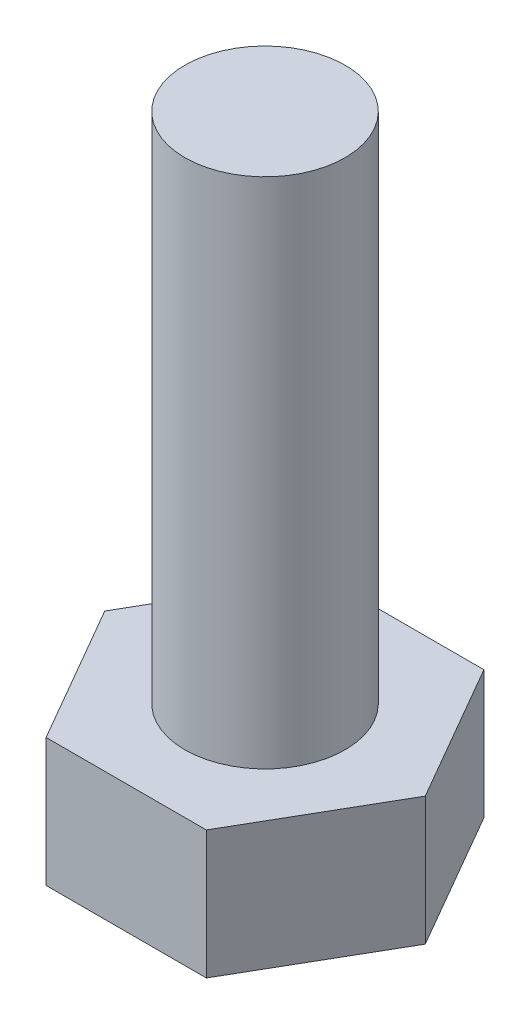
ISO-10303-21;
HEADER;
FILE_DESCRIPTION(('STEP AP214'),'2;1');
FILE_NAME('part.step','',(''),(''),'','','');
FILE_SCHEMA(('AUTOMOTIVE_DESIGN { 1 0 10303 214 1 1 1 1 }'));
ENDSEC;
DATA;
#1=APPLICATION_CONTEXT('core data for automotive mechanical design processes');
#2=APPLICATION_PROTOCOL_DEFINITION('international standard','automotive_design',2000,#1);
#3=PRODUCT_CONTEXT('',#1,'mechanical');
#4=PRODUCT('Part','Part','',(#3));
#5=PRODUCT_RELATED_PRODUCT_CATEGORY('part','',(#4));
#6=PRODUCT_DEFINITION_FORMATION('','',#4);
#7=PRODUCT_DEFINITION_CONTEXT('part definition',#1,'design');
#8=PRODUCT_DEFINITION('design','',#6,#7);
#9=PRODUCT_DEFINITION_SHAPE('','',#8);
#10=(LENGTH_UNIT() NAMED_UNIT(*) SI_UNIT(.MILLI.,.METRE.));
#11=(NAMED_UNIT(*) PLANE_ANGLE_UNIT() SI_UNIT($,.RADIAN.));
#12=(NAMED_UNIT(*) SI_UNIT($,.STERADIAN.) SOLID_ANGLE_UNIT());
#13=UNCERTAINTY_MEASURE_WITH_UNIT(LENGTH_MEASURE(1.E-05),#10,'distance_accuracy_value','');
#14=(GEOMETRIC_REPRESENTATION_CONTEXT(3) GLOBAL_UNCERTAINTY_ASSIGNED_CONTEXT((#13)) GLOBAL_UNIT_ASSIGNED_CONTEXT((#10,
#11,#12)) REPRESENTATION_CONTEXT('',''));
#15=CARTESIAN_POINT('',(0.,0.,0.));
#16=DIRECTION('',(0.,0.,1.));
#17=DIRECTION('',(1.,0.,0.));
#18=AXIS2_PLACEMENT_3D('',#15,#16,#17);
#19=CARTESIAN_POINT('',(2.5,2.,0.));
#20=DIRECTION('',(-0.866025403784439,0.,0.5));
#21=DIRECTION('',(0.5,0.,0.866025403784439));
#22=AXIS2_PLACEMENT_3D('',#19,#20,#21);
#23=PLANE('',#22);
#24=DIRECTION('',(-0.5,0.,-0.866025403784439));
#25=VECTOR('',#24,1.);
#26=CARTESIAN_POINT('',(2.5,0.,0.));
#27=LINE('',#26,#25);
#28=CARTESIAN_POINT('',(2.5,0.,0.));
#29=VERTEX_POINT('',#28);
#30=CARTESIAN_POINT('',(1.25,0.,-2.1650635094611));
#31=VERTEX_POINT('',#30);
#32=EDGE_CURVE('E134',#29,#31,#27,.T.);
#33=ORIENTED_EDGE('',*,*,#32,.T.);
#34=DIRECTION('',(0.,-1.,0.));
#35=VECTOR('',#34,1.);
#36=CARTESIAN_POINT('',(1.25,2.,-2.1650635094611));
#37=LINE('',#36,#35);
#38=CARTESIAN_POINT('',(1.25,2.,-2.1650635094611));
#39=VERTEX_POINT('',#38);
#40=EDGE_CURVE('E46',#39,#31,#37,.T.);
#41=ORIENTED_EDGE('',*,*,#40,.F.);
#42=DIRECTION('',(-0.5,0.,-0.866025403784439));
#43=VECTOR('',#42,1.);
#44=CARTESIAN_POINT('',(2.5,2.,0.));
#45=LINE('',#44,#43);
#46=CARTESIAN_POINT('',(2.5,2.,0.));
#47=VERTEX_POINT('',#46);
#48=EDGE_CURVE('E151',#47,#39,#45,.T.);
#49=ORIENTED_EDGE('',*,*,#48,.F.);
#50=DIRECTION('',(0.,-1.,0.));
#51=VECTOR('',#50,1.);
#52=CARTESIAN_POINT('',(2.5,2.,0.));
#53=LINE('',#52,#51);
#54=EDGE_CURVE('E130',#47,#29,#53,.T.);
#55=ORIENTED_EDGE('',*,*,#54,.T.);
#56=EDGE_LOOP('',(#33,#41,#49,#55));
#57=FACE_BOUND('',#56,.T.);
#58=ADVANCED_FACE('F43',(#57),#23,.F.);
#59=CARTESIAN_POINT('',(1.25,2.,-2.1650635094611));
#60=DIRECTION('',(0.,0.,1.));
#61=DIRECTION('',(1.,0.,0.));
#62=AXIS2_PLACEMENT_3D('',#59,#60,#61);
#63=PLANE('',#62);
#64=DIRECTION('',(-1.,0.,0.));
#65=VECTOR('',#64,1.);
#66=CARTESIAN_POINT('',(1.25,0.,-2.1650635094611));
#67=LINE('',#66,#65);
#68=CARTESIAN_POINT('',(-1.25,0.,-2.1650635094611));
#69=VERTEX_POINT('',#68);
#70=EDGE_CURVE('E138',#31,#69,#67,.T.);
#71=ORIENTED_EDGE('',*,*,#70,.T.);
#72=DIRECTION('',(0.,-1.,0.));
#73=VECTOR('',#72,1.);
#74=CARTESIAN_POINT('',(-1.25,2.,-2.1650635094611));
#75=LINE('',#74,#73);
#76=CARTESIAN_POINT('',(-1.25,2.,-2.1650635094611));
#77=VERTEX_POINT('',#76);
#78=EDGE_CURVE('E157',#77,#69,#75,.T.);
#79=ORIENTED_EDGE('',*,*,#78,.F.);
#80=DIRECTION('',(-1.,0.,0.));
#81=VECTOR('',#80,1.);
#82=CARTESIAN_POINT('',(1.25,2.,-2.1650635094611));
#83=LINE('',#82,#81);
#84=EDGE_CURVE('E99',#39,#77,#83,.T.);
#85=ORIENTED_EDGE('',*,*,#84,.F.);
#86=ORIENTED_EDGE('',*,*,#40,.T.);
#87=EDGE_LOOP('',(#71,#79,#85,#86));
#88=FACE_BOUND('',#87,.T.);
#89=ADVANCED_FACE('F164',(#88),#63,.F.);
#90=CARTESIAN_POINT('',(-1.25,2.,-2.1650635094611));
#91=DIRECTION('',(0.866025403784439,0.,0.5));
#92=DIRECTION('',(0.5,0.,-0.866025403784439));
#93=AXIS2_PLACEMENT_3D('',#90,#91,#92);
#94=PLANE('',#93);
#95=DIRECTION('',(-0.5,0.,0.866025403784439));
#96=VECTOR('',#95,1.);
#97=CARTESIAN_POINT('',(-1.25,0.,-2.1650635094611));
#98=LINE('',#97,#96);
#99=CARTESIAN_POINT('',(-2.5,0.,0.));
#100=VERTEX_POINT('',#99);
#101=EDGE_CURVE('E142',#69,#100,#98,.T.);
#102=ORIENTED_EDGE('',*,*,#101,.T.);
#103=DIRECTION('',(0.,-1.,0.));
#104=VECTOR('',#103,1.);
#105=CARTESIAN_POINT('',(-2.5,2.,0.));
#106=LINE('',#105,#104);
#107=CARTESIAN_POINT('',(-2.5,2.,0.));
#108=VERTEX_POINT('',#107);
#109=EDGE_CURVE('E123',#108,#100,#106,.T.);
#110=ORIENTED_EDGE('',*,*,#109,.F.);
#111=DIRECTION('',(-0.5,0.,0.866025403784439));
#112=VECTOR('',#111,1.);
#113=CARTESIAN_POINT('',(-1.25,2.,-2.1650635094611));
#114=LINE('',#113,#112);
#115=EDGE_CURVE('E112',#77,#108,#114,.T.);
#116=ORIENTED_EDGE('',*,*,#115,.F.);
#117=ORIENTED_EDGE('',*,*,#78,.T.);
#118=EDGE_LOOP('',(#102,#110,#116,#117));
#119=FACE_BOUND('',#118,.T.);
#120=ADVANCED_FACE('F170',(#119),#94,.F.);
#121=CARTESIAN_POINT('',(-2.5,2.,0.));
#122=DIRECTION('',(0.866025403784438,0.,-0.5));
#123=DIRECTION('',(-0.5,0.,-0.866025403784439));
#124=AXIS2_PLACEMENT_3D('',#121,#122,#123);
#125=PLANE('',#124);
#126=DIRECTION('',(0.5,0.,0.866025403784438));
#127=VECTOR('',#126,1.);
#128=CARTESIAN_POINT('',(-2.5,0.,0.));
#129=LINE('',#128,#127);
#130=CARTESIAN_POINT('',(-1.25,0.,2.1650635094611));
#131=VERTEX_POINT('',#130);
#132=EDGE_CURVE('E121',#100,#131,#129,.T.);
#133=ORIENTED_EDGE('',*,*,#132,.T.);
#134=DIRECTION('',(0.,-1.,0.));
#135=VECTOR('',#134,1.);
#136=CARTESIAN_POINT('',(-1.25,2.,2.1650635094611));
#137=LINE('',#136,#135);
#138=CARTESIAN_POINT('',(-1.25,2.,2.1650635094611));
#139=VERTEX_POINT('',#138);
#140=EDGE_CURVE('E118',#139,#131,#137,.T.);
#141=ORIENTED_EDGE('',*,*,#140,.F.);
#142=DIRECTION('',(0.5,0.,0.866025403784438));
#143=VECTOR('',#142,1.);
#144=CARTESIAN_POINT('',(-2.5,2.,0.));
#145=LINE('',#144,#143);
#146=EDGE_CURVE('E106',#108,#139,#145,.T.);
#147=ORIENTED_EDGE('',*,*,#146,.F.);
#148=ORIENTED_EDGE('',*,*,#109,.T.);
#149=EDGE_LOOP('',(#133,#141,#147,#148));
#150=FACE_BOUND('',#149,.T.);
#151=ADVANCED_FACE('F119',(#150),#125,.F.);
#152=CARTESIAN_POINT('',(-1.25,2.,2.1650635094611));
#153=DIRECTION('',(0.,0.,-1.));
#154=DIRECTION('',(-1.,0.,0.));
#155=AXIS2_PLACEMENT_3D('',#152,#153,#154);
#156=PLANE('',#155);
#157=DIRECTION('',(1.,0.,0.));
#158=VECTOR('',#157,1.);
#159=CARTESIAN_POINT('',(-1.25,0.,2.1650635094611));
#160=LINE('',#159,#158);
#161=CARTESIAN_POINT('',(1.25,0.,2.1650635094611));
#162=VERTEX_POINT('',#161);
#163=EDGE_CURVE('E84',#131,#162,#160,.T.);
#164=ORIENTED_EDGE('',*,*,#163,.T.);
#165=DIRECTION('',(0.,-1.,0.));
#166=VECTOR('',#165,1.);
#167=CARTESIAN_POINT('',(1.25,2.,2.1650635094611));
#168=LINE('',#167,#166);
#169=CARTESIAN_POINT('',(1.25,2.,2.1650635094611));
#170=VERTEX_POINT('',#169);
#171=EDGE_CURVE('E124',#170,#162,#168,.T.);
#172=ORIENTED_EDGE('',*,*,#171,.F.);
#173=DIRECTION('',(1.,0.,0.));
#174=VECTOR('',#173,1.);
#175=CARTESIAN_POINT('',(-1.25,2.,2.1650635094611));
#176=LINE('',#175,#174);
#177=EDGE_CURVE('E110',#139,#170,#176,.T.);
#178=ORIENTED_EDGE('',*,*,#177,.F.);
#179=ORIENTED_EDGE('',*,*,#140,.T.);
#180=EDGE_LOOP('',(#164,#172,#178,#179));
#181=FACE_BOUND('',#180,.T.);
#182=ADVANCED_FACE('F126',(#181),#156,.F.);
#183=CARTESIAN_POINT('',(1.25,2.,2.1650635094611));
#184=DIRECTION('',(-0.866025403784439,0.,-0.5));
#185=DIRECTION('',(-0.5,0.,0.866025403784439));
#186=AXIS2_PLACEMENT_3D('',#183,#184,#185);
#187=PLANE('',#186);
#188=DIRECTION('',(0.5,0.,-0.866025403784439));
#189=VECTOR('',#188,1.);
#190=CARTESIAN_POINT('',(1.25,0.,2.1650635094611));
#191=LINE('',#190,#189);
#192=EDGE_CURVE('E90',#162,#29,#191,.T.);
#193=ORIENTED_EDGE('',*,*,#192,.T.);
#194=ORIENTED_EDGE('',*,*,#54,.F.);
#195=DIRECTION('',(0.5,0.,-0.866025403784439));
#196=VECTOR('',#195,1.);
#197=CARTESIAN_POINT('',(1.25,2.,2.1650635094611));
#198=LINE('',#197,#196);
#199=EDGE_CURVE('E61',#170,#47,#198,.T.);
#200=ORIENTED_EDGE('',*,*,#199,.F.);
#201=ORIENTED_EDGE('',*,*,#171,.T.);
#202=EDGE_LOOP('',(#193,#194,#200,#201));
#203=FACE_BOUND('',#202,.T.);
#204=ADVANCED_FACE('F190',(#203),#187,.F.);
#205=CARTESIAN_POINT('',(0.,2.,0.));
#206=DIRECTION('',(0.,1.,0.));
#207=DIRECTION('',(0.,0.,1.));
#208=AXIS2_PLACEMENT_3D('',#205,#206,#207);
#209=PLANE('',#208);
#210=CARTESIAN_POINT('',(0.,2.,0.));
#211=DIRECTION('',(0.,1.,0.));
#212=DIRECTION('',(0.,0.,1.));
#213=AXIS2_PLACEMENT_3D('',#210,#211,#212);
#214=CIRCLE('',#213,1.25);
#215=CARTESIAN_POINT('',(0.,2.,1.25));
#216=VERTEX_POINT('',#215);
#217=EDGE_CURVE('E11',#216,#216,#214,.T.);
#218=ORIENTED_EDGE('',*,*,#217,.F.);
#219=EDGE_LOOP('',(#218));
#220=FACE_BOUND('',#219,.T.);
#221=ORIENTED_EDGE('',*,*,#48,.T.);
#222=ORIENTED_EDGE('',*,*,#84,.T.);
#223=ORIENTED_EDGE('',*,*,#115,.T.);
#224=ORIENTED_EDGE('',*,*,#146,.T.);
#225=ORIENTED_EDGE('',*,*,#177,.T.);
#226=ORIENTED_EDGE('',*,*,#199,.T.);
#227=EDGE_LOOP('',(#221,#222,#223,#224,#225,#226));
#228=FACE_BOUND('',#227,.T.);
#229=ADVANCED_FACE('F108',(#220,#228),#209,.T.);
#230=CARTESIAN_POINT('',(0.,0.,0.));
#231=DIRECTION('',(0.,1.,0.));
#232=DIRECTION('',(0.,0.,1.));
#233=AXIS2_PLACEMENT_3D('',#230,#231,#232);
#234=PLANE('',#233);
#235=ORIENTED_EDGE('',*,*,#32,.F.);
#236=ORIENTED_EDGE('',*,*,#192,.F.);
#237=ORIENTED_EDGE('',*,*,#163,.F.);
#238=ORIENTED_EDGE('',*,*,#132,.F.);
#239=ORIENTED_EDGE('',*,*,#101,.F.);
#240=ORIENTED_EDGE('',*,*,#70,.F.);
#241=EDGE_LOOP('',(#235,#236,#237,#238,#239,#240));
#242=FACE_BOUND('',#241,.T.);
#243=ADVANCED_FACE('F169',(#242),#234,.F.);
#244=CARTESIAN_POINT('',(0.,10.,0.));
#245=DIRECTION('',(0.,-1.,0.));
#246=DIRECTION('',(0.,0.,-1.));
#247=AXIS2_PLACEMENT_3D('',#244,#245,#246);
#248=CYLINDRICAL_SURFACE('',#247,1.25);
#249=CARTESIAN_POINT('',(0.,10.,0.));
#250=DIRECTION('',(0.,1.,0.));
#251=DIRECTION('',(0.,0.,1.));
#252=AXIS2_PLACEMENT_3D('',#249,#250,#251);
#253=CIRCLE('',#252,1.25);
#254=CARTESIAN_POINT('',(0.,10.,1.25));
#255=VERTEX_POINT('',#254);
#256=EDGE_CURVE('E139',#255,#255,#253,.T.);
#257=ORIENTED_EDGE('',*,*,#256,.F.);
#258=EDGE_LOOP('',(#257));
#259=FACE_BOUND('',#258,.T.);
#260=ORIENTED_EDGE('',*,*,#217,.T.);
#261=EDGE_LOOP('',(#260));
#262=FACE_BOUND('',#261,.T.);
#263=ADVANCED_FACE('F183',(#259,#262),#248,.T.);
#264=CARTESIAN_POINT('',(0.,10.,0.));
#265=DIRECTION('',(0.,1.,0.));
#266=DIRECTION('',(0.,0.,1.));
#267=AXIS2_PLACEMENT_3D('',#264,#265,#266);
#268=PLANE('',#267);
#269=ORIENTED_EDGE('',*,*,#256,.T.);
#270=EDGE_LOOP('',(#269));
#271=FACE_BOUND('',#270,.T.);
#272=ADVANCED_FACE('F181',(#271),#268,.T.);
#273=CLOSED_SHELL('',(#58,#89,#120,#151,#182,#204,#229,#243,#263,#272));
#274=MANIFOLD_SOLID_BREP('B2',#273);
#275=ADVANCED_BREP_SHAPE_REPRESENTATION('',(#18,#274),#14);
#276=SHAPE_DEFINITION_REPRESENTATION(#9,#275);
ENDSEC;
END-ISO-10303-21;
